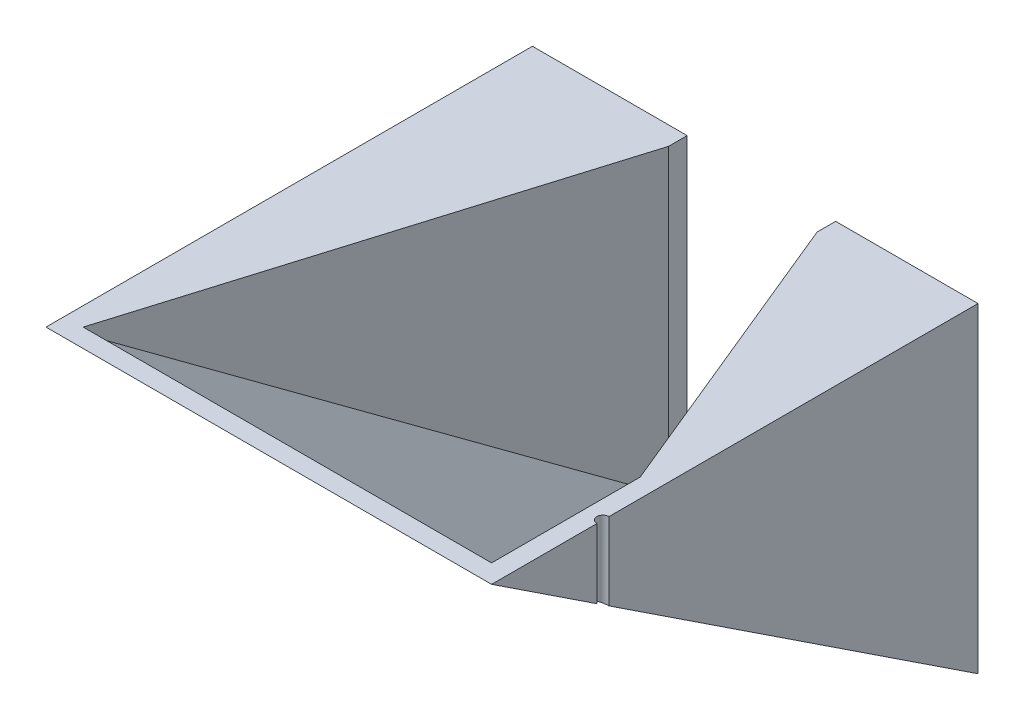
ISO-10303-21;
HEADER;
FILE_DESCRIPTION(('STEP AP214'),'2;1');
FILE_NAME('part.step','',(''),(''),'','','');
FILE_SCHEMA(('AUTOMOTIVE_DESIGN { 1 0 10303 214 1 1 1 1 }'));
ENDSEC;
DATA;
#1=APPLICATION_CONTEXT('core data for automotive mechanical design processes');
#2=APPLICATION_PROTOCOL_DEFINITION('international standard','automotive_design',2000,#1);
#3=PRODUCT_CONTEXT('',#1,'mechanical');
#4=PRODUCT('Part','Part','',(#3));
#5=PRODUCT_RELATED_PRODUCT_CATEGORY('part','',(#4));
#6=PRODUCT_DEFINITION_FORMATION('','',#4);
#7=PRODUCT_DEFINITION_CONTEXT('part definition',#1,'design');
#8=PRODUCT_DEFINITION('design','',#6,#7);
#9=PRODUCT_DEFINITION_SHAPE('','',#8);
#10=(LENGTH_UNIT() NAMED_UNIT(*) SI_UNIT(.MILLI.,.METRE.));
#11=(NAMED_UNIT(*) PLANE_ANGLE_UNIT() SI_UNIT($,.RADIAN.));
#12=(NAMED_UNIT(*) SI_UNIT($,.STERADIAN.) SOLID_ANGLE_UNIT());
#13=UNCERTAINTY_MEASURE_WITH_UNIT(LENGTH_MEASURE(1.E-05),#10,'distance_accuracy_value','');
#14=(GEOMETRIC_REPRESENTATION_CONTEXT(3) GLOBAL_UNCERTAINTY_ASSIGNED_CONTEXT((#13)) GLOBAL_UNIT_ASSIGNED_CONTEXT((#10,
#11,#12)) REPRESENTATION_CONTEXT('',''));
#15=CARTESIAN_POINT('',(0.,0.,0.));
#16=DIRECTION('',(0.,0.,1.));
#17=DIRECTION('',(1.,0.,0.));
#18=AXIS2_PLACEMENT_3D('',#15,#16,#17);
#19=CARTESIAN_POINT('',(60.,0.,0.));
#20=DIRECTION('',(1.,0.,0.));
#21=DIRECTION('',(0.,0.,-1.));
#22=AXIS2_PLACEMENT_3D('',#19,#20,#21);
#23=PLANE('',#22);
#24=DIRECTION('',(0.,1.,0.));
#25=VECTOR('',#24,1.);
#26=CARTESIAN_POINT('',(60.,-43.1758323602452,-15.815));
#27=LINE('',#26,#25);
#28=CARTESIAN_POINT('',(60.,-10.4248212027066,-15.815));
#29=VERTEX_POINT('',#28);
#30=CARTESIAN_POINT('',(60.,0.,-15.815));
#31=VERTEX_POINT('',#30);
#32=EDGE_CURVE('E11',#29,#31,#27,.T.);
#33=ORIENTED_EDGE('',*,*,#32,.F.);
#34=DIRECTION('',(0.,-0.55036115181957,-0.834926704907584));
#35=VECTOR('',#34,1.);
#36=CARTESIAN_POINT('',(60.,-43.1758323602452,-65.5));
#37=LINE('',#36,#35);
#38=CARTESIAN_POINT('',(60.,-43.1758323602452,-65.5));
#39=VERTEX_POINT('',#38);
#40=EDGE_CURVE('E161',#29,#39,#37,.T.);
#41=ORIENTED_EDGE('',*,*,#40,.T.);
#42=DIRECTION('',(0.,1.,0.));
#43=VECTOR('',#42,1.);
#44=CARTESIAN_POINT('',(60.,0.,-65.5));
#45=LINE('',#44,#43);
#46=CARTESIAN_POINT('',(60.,0.,-65.5));
#47=VERTEX_POINT('',#46);
#48=EDGE_CURVE('E143',#39,#47,#45,.T.);
#49=ORIENTED_EDGE('',*,*,#48,.T.);
#50=DIRECTION('',(0.,0.,1.));
#51=VECTOR('',#50,1.);
#52=CARTESIAN_POINT('',(60.,0.,0.));
#53=LINE('',#52,#51);
#54=EDGE_CURVE('E138',#47,#31,#53,.T.);
#55=ORIENTED_EDGE('',*,*,#54,.T.);
#56=EDGE_LOOP('',(#33,#41,#49,#55));
#57=FACE_BOUND('',#56,.T.);
#58=ADVANCED_FACE('F40',(#57),#23,.T.);
#59=CARTESIAN_POINT('',(2.5,-43.1768323602452,-2.49999999999999));
#60=DIRECTION('',(0.,0.,1.));
#61=DIRECTION('',(1.,0.,0.));
#62=AXIS2_PLACEMENT_3D('',#59,#60,#61);
#63=PLANE('',#62);
#64=DIRECTION('',(-1.,0.,0.));
#65=VECTOR('',#64,1.);
#66=CARTESIAN_POINT('',(58.5,-0.823966266416893,-2.49999999999999));
#67=LINE('',#66,#65);
#68=CARTESIAN_POINT('',(57.5,-0.823966266416891,-2.5));
#69=VERTEX_POINT('',#68);
#70=CARTESIAN_POINT('',(2.5,-0.823966266416891,-2.49999999999999));
#71=VERTEX_POINT('',#70);
#72=EDGE_CURVE('E191',#69,#71,#67,.T.);
#73=ORIENTED_EDGE('',*,*,#72,.T.);
#74=DIRECTION('',(0.,1.,0.));
#75=VECTOR('',#74,1.);
#76=CARTESIAN_POINT('',(2.5,-43.1768323602452,-2.49999999999999));
#77=LINE('',#76,#75);
#78=CARTESIAN_POINT('',(2.5,0.,-2.49999999999999));
#79=VERTEX_POINT('',#78);
#80=EDGE_CURVE('E157',#71,#79,#77,.T.);
#81=ORIENTED_EDGE('',*,*,#80,.T.);
#82=DIRECTION('',(1.,0.,0.));
#83=VECTOR('',#82,1.);
#84=CARTESIAN_POINT('',(2.5,0.,-2.49999999999999));
#85=LINE('',#84,#83);
#86=CARTESIAN_POINT('',(57.5,0.,-2.5));
#87=VERTEX_POINT('',#86);
#88=EDGE_CURVE('E187',#79,#87,#85,.T.);
#89=ORIENTED_EDGE('',*,*,#88,.T.);
#90=DIRECTION('',(0.,1.,0.));
#91=VECTOR('',#90,1.);
#92=CARTESIAN_POINT('',(57.5,-43.1768323602452,-2.5));
#93=LINE('',#92,#91);
#94=EDGE_CURVE('E180',#69,#87,#93,.T.);
#95=ORIENTED_EDGE('',*,*,#94,.F.);
#96=EDGE_LOOP('',(#73,#81,#89,#95));
#97=FACE_BOUND('',#96,.T.);
#98=ADVANCED_FACE('F241',(#97),#63,.F.);
#99=CARTESIAN_POINT('',(57.5,-43.1768323602452,-2.5));
#100=DIRECTION('',(1.,0.,0.));
#101=DIRECTION('',(0.,0.,-1.));
#102=AXIS2_PLACEMENT_3D('',#99,#100,#101);
#103=PLANE('',#102);
#104=DIRECTION('',(0.,0.,-1.));
#105=VECTOR('',#104,1.);
#106=CARTESIAN_POINT('',(57.5,0.,-2.5));
#107=LINE('',#106,#105);
#108=CARTESIAN_POINT('',(57.5,0.,-22.5));
#109=VERTEX_POINT('',#108);
#110=EDGE_CURVE('E182',#87,#109,#107,.T.);
#111=ORIENTED_EDGE('',*,*,#110,.T.);
#112=DIRECTION('',(0.,1.,0.));
#113=VECTOR('',#112,1.);
#114=CARTESIAN_POINT('',(57.5,-43.1778323602452,-22.5));
#115=LINE('',#114,#113);
#116=CARTESIAN_POINT('',(57.5,-14.0087376915391,-22.5));
#117=VERTEX_POINT('',#116);
#118=EDGE_CURVE('E206',#117,#109,#115,.T.);
#119=ORIENTED_EDGE('',*,*,#118,.F.);
#120=DIRECTION('',(0.,-0.550399306861897,-0.8349015528827));
#121=VECTOR('',#120,1.);
#122=CARTESIAN_POINT('',(57.5,-13.6543179818513,-21.9623801987003));
#123=LINE('',#122,#121);
#124=EDGE_CURVE('E168',#69,#117,#123,.T.);
#125=ORIENTED_EDGE('',*,*,#124,.F.);
#126=ORIENTED_EDGE('',*,*,#94,.T.);
#127=EDGE_LOOP('',(#111,#119,#125,#126));
#128=FACE_BOUND('',#127,.T.);
#129=ADVANCED_FACE('F252',(#128),#103,.F.);
#130=CARTESIAN_POINT('',(60.,-43.1758323602452,-65.5));
#131=DIRECTION('',(0.,0.834926704907584,-0.55036115181957));
#132=DIRECTION('',(0.,0.55036115181957,0.834926704907585));
#133=AXIS2_PLACEMENT_3D('',#130,#131,#132);
#134=PLANE('',#133);
#135=ORIENTED_EDGE('',*,*,#40,.F.);
#136=CARTESIAN_POINT('',(60.,-9.88759519700273,-15.));
#137=DIRECTION('',(0.,0.834926704907584,-0.55036115181957));
#138=DIRECTION('',(0.,0.55036115181957,0.834926704907585));
#139=AXIS2_PLACEMENT_3D('',#136,#137,#138);
#140=ELLIPSE('',#139,0.976133587786265,0.815000000000005);
#141=CARTESIAN_POINT('',(60.,-9.3503691912989,-14.185));
#142=VERTEX_POINT('',#141);
#143=EDGE_CURVE('E129',#29,#142,#140,.T.);
#144=ORIENTED_EDGE('',*,*,#143,.T.);
#145=CARTESIAN_POINT('',(60.,0.,0.));
#146=VERTEX_POINT('',#145);
#147=EDGE_CURVE('E174',#146,#142,#37,.T.);
#148=ORIENTED_EDGE('',*,*,#147,.F.);
#149=DIRECTION('',(-1.,0.,0.));
#150=VECTOR('',#149,1.);
#151=CARTESIAN_POINT('',(60.,0.,0.));
#152=LINE('',#151,#150);
#153=CARTESIAN_POINT('',(0.,0.,0.));
#154=VERTEX_POINT('',#153);
#155=EDGE_CURVE('E145',#146,#154,#152,.T.);
#156=ORIENTED_EDGE('',*,*,#155,.T.);
#157=DIRECTION('',(0.,-0.55036115181957,-0.834926704907584));
#158=VECTOR('',#157,1.);
#159=CARTESIAN_POINT('',(0.,-43.1758323602452,-65.5));
#160=LINE('',#159,#158);
#161=CARTESIAN_POINT('',(0.,-43.1758323602452,-65.5));
#162=VERTEX_POINT('',#161);
#163=EDGE_CURVE('E153',#154,#162,#160,.T.);
#164=ORIENTED_EDGE('',*,*,#163,.T.);
#165=DIRECTION('',(-1.,0.,0.));
#166=VECTOR('',#165,1.);
#167=CARTESIAN_POINT('',(60.,-43.1758323602452,-65.5));
#168=LINE('',#167,#166);
#169=EDGE_CURVE('E165',#39,#162,#168,.T.);
#170=ORIENTED_EDGE('',*,*,#169,.F.);
#171=EDGE_LOOP('',(#135,#144,#148,#156,#164,#170));
#172=FACE_BOUND('',#171,.T.);
#173=ADVANCED_FACE('F42',(#172),#134,.F.);
#174=CARTESIAN_POINT('',(60.,0.,-65.5));
#175=DIRECTION('',(0.,0.,1.));
#176=DIRECTION('',(1.,0.,0.));
#177=AXIS2_PLACEMENT_3D('',#174,#175,#176);
#178=PLANE('',#177);
#179=DIRECTION('',(-1.,0.,0.));
#180=VECTOR('',#179,1.);
#181=CARTESIAN_POINT('',(60.,0.,-65.5));
#182=LINE('',#181,#180);
#183=CARTESIAN_POINT('',(20.8346215139251,0.,-65.5));
#184=VERTEX_POINT('',#183);
#185=CARTESIAN_POINT('',(0.,0.,-65.5));
#186=VERTEX_POINT('',#185);
#187=EDGE_CURVE('E148',#184,#186,#182,.T.);
#188=ORIENTED_EDGE('',*,*,#187,.F.);
#189=DIRECTION('',(0.,-1.,0.));
#190=VECTOR('',#189,1.);
#191=CARTESIAN_POINT('',(20.8346215139251,0.,-65.5));
#192=LINE('',#191,#190);
#193=CARTESIAN_POINT('',(20.8346215139251,-40.7078998274115,-65.5));
#194=VERTEX_POINT('',#193);
#195=EDGE_CURVE('E215',#184,#194,#192,.T.);
#196=ORIENTED_EDGE('',*,*,#195,.T.);
#197=DIRECTION('',(1.,0.,0.));
#198=VECTOR('',#197,1.);
#199=CARTESIAN_POINT('',(60.,-40.7078998274115,-65.5));
#200=LINE('',#199,#198);
#201=CARTESIAN_POINT('',(40.8346215139251,-40.7078998274115,-65.5));
#202=VERTEX_POINT('',#201);
#203=EDGE_CURVE('E212',#194,#202,#200,.T.);
#204=ORIENTED_EDGE('',*,*,#203,.T.);
#205=DIRECTION('',(0.,1.,0.));
#206=VECTOR('',#205,1.);
#207=CARTESIAN_POINT('',(40.8346215139251,0.,-65.5));
#208=LINE('',#207,#206);
#209=CARTESIAN_POINT('',(40.8346215139251,0.,-65.5));
#210=VERTEX_POINT('',#209);
#211=EDGE_CURVE('E218',#202,#210,#208,.T.);
#212=ORIENTED_EDGE('',*,*,#211,.T.);
#213=EDGE_CURVE('E163',#47,#210,#182,.T.);
#214=ORIENTED_EDGE('',*,*,#213,.F.);
#215=ORIENTED_EDGE('',*,*,#48,.F.);
#216=ORIENTED_EDGE('',*,*,#169,.T.);
#217=DIRECTION('',(0.,1.,0.));
#218=VECTOR('',#217,1.);
#219=CARTESIAN_POINT('',(0.,0.,-65.5));
#220=LINE('',#219,#218);
#221=EDGE_CURVE('E156',#162,#186,#220,.T.);
#222=ORIENTED_EDGE('',*,*,#221,.T.);
#223=EDGE_LOOP('',(#188,#196,#204,#212,#214,#215,#216,#222));
#224=FACE_BOUND('',#223,.T.);
#225=ADVANCED_FACE('F259',(#224),#178,.F.);
#226=CARTESIAN_POINT('',(60.,0.,0.));
#227=DIRECTION('',(0.,-1.,0.));
#228=DIRECTION('',(0.,0.,-1.));
#229=AXIS2_PLACEMENT_3D('',#226,#227,#228);
#230=PLANE('',#229);
#231=CARTESIAN_POINT('',(60.,0.,-14.185));
#232=VERTEX_POINT('',#231);
#233=EDGE_CURVE('E140',#232,#146,#53,.T.);
#234=ORIENTED_EDGE('',*,*,#233,.F.);
#235=CARTESIAN_POINT('',(60.,0.,-15.));
#236=DIRECTION('',(0.,1.,0.));
#237=DIRECTION('',(0.,0.,1.));
#238=AXIS2_PLACEMENT_3D('',#235,#236,#237);
#239=CIRCLE('',#238,0.815000000000005);
#240=EDGE_CURVE('E54',#31,#232,#239,.T.);
#241=ORIENTED_EDGE('',*,*,#240,.F.);
#242=ORIENTED_EDGE('',*,*,#54,.F.);
#243=ORIENTED_EDGE('',*,*,#213,.T.);
#244=DIRECTION('',(0.,0.,1.));
#245=VECTOR('',#244,1.);
#246=CARTESIAN_POINT('',(40.8346215139251,0.,-66.));
#247=LINE('',#246,#245);
#248=CARTESIAN_POINT('',(40.8346215139251,0.,-63.));
#249=VERTEX_POINT('',#248);
#250=EDGE_CURVE('E225',#210,#249,#247,.T.);
#251=ORIENTED_EDGE('',*,*,#250,.T.);
#252=DIRECTION('',(0.380533237716896,0.,0.92476724368497));
#253=VECTOR('',#252,1.);
#254=CARTESIAN_POINT('',(57.5,0.,-22.5));
#255=LINE('',#254,#253);
#256=EDGE_CURVE('E203',#249,#109,#255,.T.);
#257=ORIENTED_EDGE('',*,*,#256,.T.);
#258=ORIENTED_EDGE('',*,*,#110,.F.);
#259=ORIENTED_EDGE('',*,*,#88,.F.);
#260=DIRECTION('',(0.290026058502414,0.,-0.95701874871371));
#261=VECTOR('',#260,1.);
#262=CARTESIAN_POINT('',(20.8346215139251,0.,-63.));
#263=LINE('',#262,#261);
#264=CARTESIAN_POINT('',(20.8346215139251,0.,-63.));
#265=VERTEX_POINT('',#264);
#266=EDGE_CURVE('E200',#79,#265,#263,.T.);
#267=ORIENTED_EDGE('',*,*,#266,.T.);
#268=DIRECTION('',(0.,0.,1.));
#269=VECTOR('',#268,1.);
#270=CARTESIAN_POINT('',(20.8346215139251,0.,-66.));
#271=LINE('',#270,#269);
#272=EDGE_CURVE('E221',#184,#265,#271,.T.);
#273=ORIENTED_EDGE('',*,*,#272,.F.);
#274=ORIENTED_EDGE('',*,*,#187,.T.);
#275=DIRECTION('',(0.,0.,1.));
#276=VECTOR('',#275,1.);
#277=CARTESIAN_POINT('',(0.,0.,0.));
#278=LINE('',#277,#276);
#279=EDGE_CURVE('E160',#186,#154,#278,.T.);
#280=ORIENTED_EDGE('',*,*,#279,.T.);
#281=ORIENTED_EDGE('',*,*,#155,.F.);
#282=EDGE_LOOP('',(#234,#241,#242,#243,#251,#257,#258,#259,#267,#273,#274,#280,#281));
#283=FACE_BOUND('',#282,.T.);
#284=ADVANCED_FACE('F136',(#283),#230,.F.);
#285=DIRECTION('',(0.,1.,0.));
#286=VECTOR('',#285,1.);
#287=CARTESIAN_POINT('',(60.,-43.1758323602452,-14.185));
#288=LINE('',#287,#286);
#289=EDGE_CURVE('E48',#232,#142,#288,.F.);
#290=ORIENTED_EDGE('',*,*,#289,.F.);
#291=ORIENTED_EDGE('',*,*,#233,.T.);
#292=ORIENTED_EDGE('',*,*,#147,.T.);
#293=EDGE_LOOP('',(#290,#291,#292));
#294=FACE_BOUND('',#293,.T.);
#295=ADVANCED_FACE('F178',(#294),#23,.T.);
#296=CARTESIAN_POINT('',(0.,0.,0.));
#297=DIRECTION('',(1.,0.,0.));
#298=DIRECTION('',(0.,0.,-1.));
#299=AXIS2_PLACEMENT_3D('',#296,#297,#298);
#300=PLANE('',#299);
#301=ORIENTED_EDGE('',*,*,#163,.F.);
#302=ORIENTED_EDGE('',*,*,#279,.F.);
#303=ORIENTED_EDGE('',*,*,#221,.F.);
#304=EDGE_LOOP('',(#301,#302,#303));
#305=FACE_BOUND('',#304,.T.);
#306=ADVANCED_FACE('F268',(#305),#300,.F.);
#307=CARTESIAN_POINT('',(58.5,-0.823966266416893,-2.49999999999999));
#308=DIRECTION('',(0.,-0.8349015528827,0.550399306861897));
#309=DIRECTION('',(0.,-0.550399306861897,-0.8349015528827));
#310=AXIS2_PLACEMENT_3D('',#307,#308,#309);
#311=PLANE('',#310);
#312=ORIENTED_EDGE('',*,*,#124,.T.);
#313=DIRECTION('',(0.324914266051785,0.520536552879559,0.789602695557896));
#314=VECTOR('',#313,1.);
#315=CARTESIAN_POINT('',(52.5666382516841,-21.9123460796267,-34.4889956879012));
#316=LINE('',#315,#314);
#317=CARTESIAN_POINT('',(40.8346215139251,-40.7078998274115,-63.));
#318=VERTEX_POINT('',#317);
#319=EDGE_CURVE('E209',#318,#117,#316,.T.);
#320=ORIENTED_EDGE('',*,*,#319,.F.);
#321=DIRECTION('',(-1.,0.,0.));
#322=VECTOR('',#321,1.);
#323=CARTESIAN_POINT('',(58.5,-40.7078998274115,-63.));
#324=LINE('',#323,#322);
#325=CARTESIAN_POINT('',(20.8346215139251,-40.7078998274115,-63.));
#326=VERTEX_POINT('',#325);
#327=EDGE_CURVE('E62',#318,#326,#324,.T.);
#328=ORIENTED_EDGE('',*,*,#327,.T.);
#329=DIRECTION('',(0.245288568197267,-0.533584669300159,-0.809395403371909));
#330=VECTOR('',#329,1.);
#331=CARTESIAN_POINT('',(21.1578917659479,-41.4111207389602,-64.0667168794582));
#332=LINE('',#331,#330);
#333=EDGE_CURVE('E194',#71,#326,#332,.T.);
#334=ORIENTED_EDGE('',*,*,#333,.F.);
#335=ORIENTED_EDGE('',*,*,#72,.F.);
#336=EDGE_LOOP('',(#312,#320,#328,#334,#335));
#337=FACE_BOUND('',#336,.T.);
#338=ADVANCED_FACE('F244',(#337),#311,.F.);
#339=CARTESIAN_POINT('',(20.8346215139251,-43.1778323602452,-63.));
#340=DIRECTION('',(0.95701874871371,0.,0.290026058502414));
#341=DIRECTION('',(0.290026058502414,0.,-0.95701874871371));
#342=AXIS2_PLACEMENT_3D('',#339,#340,#341);
#343=PLANE('',#342);
#344=ORIENTED_EDGE('',*,*,#80,.F.);
#345=ORIENTED_EDGE('',*,*,#333,.T.);
#346=DIRECTION('',(0.,1.,0.));
#347=VECTOR('',#346,1.);
#348=CARTESIAN_POINT('',(20.8346215139251,-43.1778323602452,-63.));
#349=LINE('',#348,#347);
#350=EDGE_CURVE('E197',#326,#265,#349,.T.);
#351=ORIENTED_EDGE('',*,*,#350,.T.);
#352=ORIENTED_EDGE('',*,*,#266,.F.);
#353=EDGE_LOOP('',(#344,#345,#351,#352));
#354=FACE_BOUND('',#353,.T.);
#355=ADVANCED_FACE('F235',(#354),#343,.T.);
#356=CARTESIAN_POINT('',(57.5,-43.1778323602452,-22.5));
#357=DIRECTION('',(-0.92476724368497,0.,0.380533237716896));
#358=DIRECTION('',(0.380533237716896,0.,0.92476724368497));
#359=AXIS2_PLACEMENT_3D('',#356,#357,#358);
#360=PLANE('',#359);
#361=DIRECTION('',(0.,1.,0.));
#362=VECTOR('',#361,1.);
#363=CARTESIAN_POINT('',(40.8346215139251,-43.1778323602452,-63.));
#364=LINE('',#363,#362);
#365=EDGE_CURVE('E207',#318,#249,#364,.T.);
#366=ORIENTED_EDGE('',*,*,#365,.F.);
#367=ORIENTED_EDGE('',*,*,#319,.T.);
#368=ORIENTED_EDGE('',*,*,#118,.T.);
#369=ORIENTED_EDGE('',*,*,#256,.F.);
#370=EDGE_LOOP('',(#366,#367,#368,#369));
#371=FACE_BOUND('',#370,.T.);
#372=ADVANCED_FACE('F249',(#371),#360,.T.);
#373=CARTESIAN_POINT('',(40.8346215139251,-40.7078998274115,-66.));
#374=DIRECTION('',(0.,-1.,0.));
#375=DIRECTION('',(0.,0.,-1.));
#376=AXIS2_PLACEMENT_3D('',#373,#374,#375);
#377=PLANE('',#376);
#378=DIRECTION('',(0.,0.,1.));
#379=VECTOR('',#378,1.);
#380=CARTESIAN_POINT('',(20.8346215139251,-40.7078998274115,-66.));
#381=LINE('',#380,#379);
#382=EDGE_CURVE('E176',#194,#326,#381,.T.);
#383=ORIENTED_EDGE('',*,*,#382,.T.);
#384=ORIENTED_EDGE('',*,*,#327,.F.);
#385=DIRECTION('',(0.,0.,1.));
#386=VECTOR('',#385,1.);
#387=CARTESIAN_POINT('',(40.8346215139251,-40.7078998274115,-66.));
#388=LINE('',#387,#386);
#389=EDGE_CURVE('E223',#202,#318,#388,.T.);
#390=ORIENTED_EDGE('',*,*,#389,.F.);
#391=ORIENTED_EDGE('',*,*,#203,.F.);
#392=EDGE_LOOP('',(#383,#384,#390,#391));
#393=FACE_BOUND('',#392,.T.);
#394=ADVANCED_FACE('F285',(#393),#377,.F.);
#395=CARTESIAN_POINT('',(20.8346215139251,-40.7078998274115,-66.));
#396=DIRECTION('',(-1.,0.,0.));
#397=DIRECTION('',(0.,0.,1.));
#398=AXIS2_PLACEMENT_3D('',#395,#396,#397);
#399=PLANE('',#398);
#400=ORIENTED_EDGE('',*,*,#272,.T.);
#401=ORIENTED_EDGE('',*,*,#350,.F.);
#402=ORIENTED_EDGE('',*,*,#382,.F.);
#403=ORIENTED_EDGE('',*,*,#195,.F.);
#404=EDGE_LOOP('',(#400,#401,#402,#403));
#405=FACE_BOUND('',#404,.T.);
#406=ADVANCED_FACE('F231',(#405),#399,.F.);
#407=CARTESIAN_POINT('',(40.8346215139251,0.,-66.));
#408=DIRECTION('',(1.,0.,0.));
#409=DIRECTION('',(0.,0.,-1.));
#410=AXIS2_PLACEMENT_3D('',#407,#408,#409);
#411=PLANE('',#410);
#412=ORIENTED_EDGE('',*,*,#389,.T.);
#413=ORIENTED_EDGE('',*,*,#365,.T.);
#414=ORIENTED_EDGE('',*,*,#250,.F.);
#415=ORIENTED_EDGE('',*,*,#211,.F.);
#416=EDGE_LOOP('',(#412,#413,#414,#415));
#417=FACE_BOUND('',#416,.T.);
#418=ADVANCED_FACE('F284',(#417),#411,.F.);
#419=CARTESIAN_POINT('',(60.,-43.1758323602452,-15.));
#420=DIRECTION('',(0.,1.,0.));
#421=DIRECTION('',(0.,0.,1.));
#422=AXIS2_PLACEMENT_3D('',#419,#420,#421);
#423=CYLINDRICAL_SURFACE('',#422,0.815000000000005);
#424=ORIENTED_EDGE('',*,*,#32,.T.);
#425=ORIENTED_EDGE('',*,*,#240,.T.);
#426=ORIENTED_EDGE('',*,*,#289,.T.);
#427=ORIENTED_EDGE('',*,*,#143,.F.);
#428=EDGE_LOOP('',(#424,#425,#426,#427));
#429=FACE_BOUND('',#428,.T.);
#430=ADVANCED_FACE('F127',(#429),#423,.F.);
#431=CLOSED_SHELL('',(#58,#98,#129,#173,#225,#284,#295,#306,#338,#355,#372,#394,#406,#418,#430));
#432=MANIFOLD_SOLID_BREP('B2',#431);
#433=ADVANCED_BREP_SHAPE_REPRESENTATION('',(#18,#432),#14);
#434=SHAPE_DEFINITION_REPRESENTATION(#9,#433);
ENDSEC;
END-ISO-10303-21;
